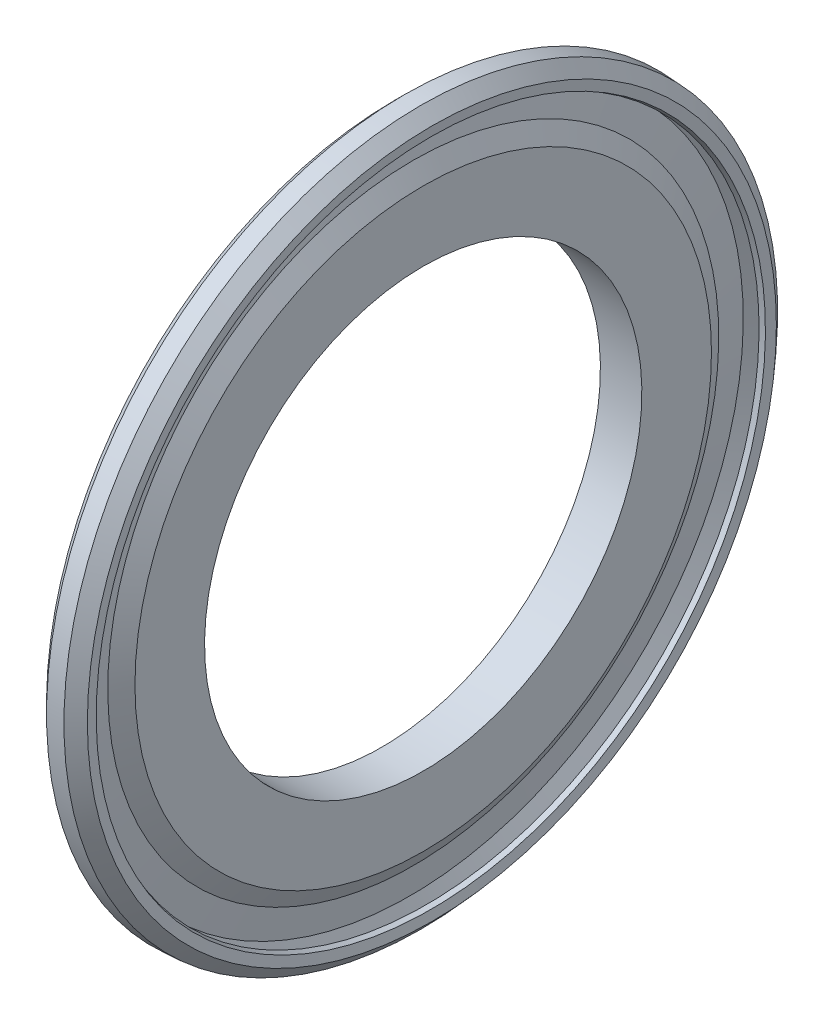
ISO-10303-21;
HEADER;
FILE_DESCRIPTION(('STEP AP214'),'2;1');
FILE_NAME('part.step','',(''),(''),'','','');
FILE_SCHEMA(('AUTOMOTIVE_DESIGN { 1 0 10303 214 1 1 1 1 }'));
ENDSEC;
DATA;
#1=APPLICATION_CONTEXT('core data for automotive mechanical design processes');
#2=APPLICATION_PROTOCOL_DEFINITION('international standard','automotive_design',2000,#1);
#3=PRODUCT_CONTEXT('',#1,'mechanical');
#4=PRODUCT('Part','Part','',(#3));
#5=PRODUCT_RELATED_PRODUCT_CATEGORY('part','',(#4));
#6=PRODUCT_DEFINITION_FORMATION('','',#4);
#7=PRODUCT_DEFINITION_CONTEXT('part definition',#1,'design');
#8=PRODUCT_DEFINITION('design','',#6,#7);
#9=PRODUCT_DEFINITION_SHAPE('','',#8);
#10=(LENGTH_UNIT() NAMED_UNIT(*) SI_UNIT(.MILLI.,.METRE.));
#11=(NAMED_UNIT(*) PLANE_ANGLE_UNIT() SI_UNIT($,.RADIAN.));
#12=(NAMED_UNIT(*) SI_UNIT($,.STERADIAN.) SOLID_ANGLE_UNIT());
#13=UNCERTAINTY_MEASURE_WITH_UNIT(LENGTH_MEASURE(1.E-05),#10,'distance_accuracy_value','');
#14=(GEOMETRIC_REPRESENTATION_CONTEXT(3) GLOBAL_UNCERTAINTY_ASSIGNED_CONTEXT((#13)) GLOBAL_UNIT_ASSIGNED_CONTEXT((#10,
#11,#12)) REPRESENTATION_CONTEXT('',''));
#15=CARTESIAN_POINT('',(0.,0.,0.));
#16=DIRECTION('',(0.,0.,1.));
#17=DIRECTION('',(1.,0.,0.));
#18=AXIS2_PLACEMENT_3D('',#15,#16,#17);
#19=CARTESIAN_POINT('',(1.17595074696361,0.,0.));
#20=DIRECTION('',(-1.,0.,0.));
#21=DIRECTION('',(0.,1.,0.));
#22=AXIS2_PLACEMENT_3D('',#19,#20,#21);
#23=CONICAL_SURFACE('',#22,2.58939401298403,0.837758040957279);
#24=CARTESIAN_POINT('',(1.21689405329676,0.,0.));
#25=DIRECTION('',(-1.,0.,0.));
#26=DIRECTION('',(0.,1.,0.));
#27=AXIS2_PLACEMENT_3D('',#24,#25,#26);
#28=CIRCLE('',#27,2.54392186457195);
#29=CARTESIAN_POINT('',(1.21689405329676,2.54392186457195,0.));
#30=VERTEX_POINT('',#29);
#31=EDGE_CURVE('E11',#30,#30,#28,.T.);
#32=ORIENTED_EDGE('',*,*,#31,.T.);
#33=EDGE_LOOP('',(#32));
#34=FACE_BOUND('',#33,.T.);
#35=CARTESIAN_POINT('',(1.13500744063047,0.,0.));
#36=DIRECTION('',(-1.,0.,0.));
#37=DIRECTION('',(0.,1.,0.));
#38=AXIS2_PLACEMENT_3D('',#35,#36,#37);
#39=CIRCLE('',#38,2.63486616139611);
#40=CARTESIAN_POINT('',(1.13500744063047,2.63486616139611,0.));
#41=VERTEX_POINT('',#40);
#42=EDGE_CURVE('E83',#41,#41,#39,.T.);
#43=ORIENTED_EDGE('',*,*,#42,.F.);
#44=EDGE_LOOP('',(#43));
#45=FACE_BOUND('',#44,.T.);
#46=ADVANCED_FACE('F19',(#34,#45),#23,.T.);
#47=CARTESIAN_POINT('',(1.21561485881621,0.,0.));
#48=DIRECTION('',(1.,0.,0.));
#49=DIRECTION('',(0.,1.,0.));
#50=AXIS2_PLACEMENT_3D('',#47,#48,#49);
#51=CONICAL_SURFACE('',#50,2.53175114207618,1.46607657167523);
#52=ORIENTED_EDGE('',*,*,#31,.F.);
#53=EDGE_LOOP('',(#52));
#54=FACE_BOUND('',#53,.T.);
#55=CARTESIAN_POINT('',(1.20921888641347,0.,0.));
#56=DIRECTION('',(-1.,0.,0.));
#57=DIRECTION('',(0.,1.,0.));
#58=AXIS2_PLACEMENT_3D('',#55,#56,#57);
#59=CIRCLE('',#58,2.47089752959736);
#60=CARTESIAN_POINT('',(1.20921888641347,2.47089752959736,0.));
#61=VERTEX_POINT('',#60);
#62=EDGE_CURVE('E29',#61,#61,#59,.T.);
#63=ORIENTED_EDGE('',*,*,#62,.T.);
#64=EDGE_LOOP('',(#63));
#65=FACE_BOUND('',#64,.T.);
#66=ADVANCED_FACE('F124',(#54,#65),#51,.F.);
#67=CARTESIAN_POINT('',(1.19196928410883,0.,0.));
#68=DIRECTION('',(1.,0.,0.));
#69=DIRECTION('',(0.,1.,0.));
#70=AXIS2_PLACEMENT_3D('',#67,#68,#69);
#71=CONICAL_SURFACE('',#70,2.46461918780554,0.349065850398863);
#72=CARTESIAN_POINT('',(1.1747196818042,0.,0.));
#73=DIRECTION('',(-1.,0.,0.));
#74=DIRECTION('',(0.,1.,0.));
#75=AXIS2_PLACEMENT_3D('',#72,#73,#74);
#76=CIRCLE('',#75,2.45834084601373);
#77=CARTESIAN_POINT('',(1.1747196818042,2.45834084601373,0.));
#78=VERTEX_POINT('',#77);
#79=EDGE_CURVE('E68',#78,#78,#76,.T.);
#80=ORIENTED_EDGE('',*,*,#79,.T.);
#81=EDGE_LOOP('',(#80));
#82=FACE_BOUND('',#81,.T.);
#83=ORIENTED_EDGE('',*,*,#62,.F.);
#84=EDGE_LOOP('',(#83));
#85=FACE_BOUND('',#84,.T.);
#86=ADVANCED_FACE('F69',(#82,#85),#71,.F.);
#87=CARTESIAN_POINT('',(1.1405033328156,0.,0.));
#88=DIRECTION('',(-1.,0.,0.));
#89=DIRECTION('',(0.,1.,0.));
#90=AXIS2_PLACEMENT_3D('',#87,#88,#89);
#91=CONICAL_SURFACE('',#90,2.50906866950923,0.977384381116825);
#92=CARTESIAN_POINT('',(1.10628698382701,0.,0.));
#93=DIRECTION('',(-1.,0.,0.));
#94=DIRECTION('',(0.,1.,0.));
#95=AXIS2_PLACEMENT_3D('',#92,#93,#94);
#96=CIRCLE('',#95,2.55979649300472);
#97=CARTESIAN_POINT('',(1.10628698382701,2.55979649300472,0.));
#98=VERTEX_POINT('',#97);
#99=EDGE_CURVE('E72',#98,#98,#96,.T.);
#100=ORIENTED_EDGE('',*,*,#99,.T.);
#101=EDGE_LOOP('',(#100));
#102=FACE_BOUND('',#101,.T.);
#103=ORIENTED_EDGE('',*,*,#79,.F.);
#104=EDGE_LOOP('',(#103));
#105=FACE_BOUND('',#104,.T.);
#106=ADVANCED_FACE('F119',(#102,#105),#91,.F.);
#107=CARTESIAN_POINT('',(1.08018312218057,0.,0.));
#108=DIRECTION('',(1.,0.,0.));
#109=DIRECTION('',(0.,1.,0.));
#110=AXIS2_PLACEMENT_3D('',#107,#108,#109);
#111=CONICAL_SURFACE('',#110,2.51102511133686,1.07936423665164);
#112=CARTESIAN_POINT('',(1.05407926053413,0.,0.));
#113=DIRECTION('',(-1.,0.,0.));
#114=DIRECTION('',(0.,1.,0.));
#115=AXIS2_PLACEMENT_3D('',#112,#113,#114);
#116=CIRCLE('',#115,2.46225372966898);
#117=CARTESIAN_POINT('',(1.05407926053413,2.46225372966898,0.));
#118=VERTEX_POINT('',#117);
#119=EDGE_CURVE('E75',#118,#118,#116,.T.);
#120=ORIENTED_EDGE('',*,*,#119,.T.);
#121=EDGE_LOOP('',(#120));
#122=FACE_BOUND('',#121,.T.);
#123=ORIENTED_EDGE('',*,*,#99,.F.);
#124=EDGE_LOOP('',(#123));
#125=FACE_BOUND('',#124,.T.);
#126=ADVANCED_FACE('F103',(#122,#125),#111,.F.);
#127=CARTESIAN_POINT('',(1.06675622894778,0.,0.));
#128=DIRECTION('',(-1.,0.,0.));
#129=DIRECTION('',(0.,1.,0.));
#130=AXIS2_PLACEMENT_3D('',#127,#128,#129);
#131=CONICAL_SURFACE('',#130,2.35900810725175,1.44862327915529);
#132=CARTESIAN_POINT('',(1.07943319736143,0.,0.));
#133=DIRECTION('',(-1.,0.,0.));
#134=DIRECTION('',(0.,1.,0.));
#135=AXIS2_PLACEMENT_3D('',#132,#133,#134);
#136=CIRCLE('',#135,2.25576248483451);
#137=CARTESIAN_POINT('',(1.07943319736143,2.25576248483451,0.));
#138=VERTEX_POINT('',#137);
#139=EDGE_CURVE('E84',#138,#138,#136,.T.);
#140=ORIENTED_EDGE('',*,*,#139,.T.);
#141=EDGE_LOOP('',(#140));
#142=FACE_BOUND('',#141,.T.);
#143=ORIENTED_EDGE('',*,*,#119,.F.);
#144=EDGE_LOOP('',(#143));
#145=FACE_BOUND('',#144,.T.);
#146=ADVANCED_FACE('F106',(#142,#145),#131,.T.);
#147=CARTESIAN_POINT('',(1.11614648407471,0.,0.));
#148=DIRECTION('',(-1.,0.,0.));
#149=DIRECTION('',(0.,1.,0.));
#150=AXIS2_PLACEMENT_3D('',#147,#148,#149);
#151=CONICAL_SURFACE('',#150,2.19217320693425,1.0471975511966);
#152=CARTESIAN_POINT('',(1.152859770788,0.,0.));
#153=DIRECTION('',(-1.,0.,0.));
#154=DIRECTION('',(0.,1.,0.));
#155=AXIS2_PLACEMENT_3D('',#152,#153,#154);
#156=CIRCLE('',#155,2.128583929034);
#157=CARTESIAN_POINT('',(1.152859770788,2.128583929034,0.));
#158=VERTEX_POINT('',#157);
#159=EDGE_CURVE('E87',#158,#158,#156,.T.);
#160=ORIENTED_EDGE('',*,*,#159,.T.);
#161=EDGE_LOOP('',(#160));
#162=FACE_BOUND('',#161,.T.);
#163=ORIENTED_EDGE('',*,*,#139,.F.);
#164=EDGE_LOOP('',(#163));
#165=FACE_BOUND('',#164,.T.);
#166=ADVANCED_FACE('F108',(#162,#165),#151,.T.);
#167=CARTESIAN_POINT('',(1.152859770788,1.87159092204099,0.));
#168=DIRECTION('',(1.,0.,0.));
#169=DIRECTION('',(0.,-1.,0.));
#170=AXIS2_PLACEMENT_3D('',#167,#168,#169);
#171=PLANE('',#170);
#172=CARTESIAN_POINT('',(1.152859770788,0.,0.));
#173=DIRECTION('',(-1.,0.,0.));
#174=DIRECTION('',(0.,1.,0.));
#175=AXIS2_PLACEMENT_3D('',#172,#173,#174);
#176=CIRCLE('',#175,1.61459791504798);
#177=CARTESIAN_POINT('',(1.152859770788,1.61459791504798,0.));
#178=VERTEX_POINT('',#177);
#179=EDGE_CURVE('E91',#178,#178,#176,.T.);
#180=ORIENTED_EDGE('',*,*,#179,.T.);
#181=EDGE_LOOP('',(#180));
#182=FACE_BOUND('',#181,.T.);
#183=ORIENTED_EDGE('',*,*,#159,.F.);
#184=EDGE_LOOP('',(#183));
#185=FACE_BOUND('',#184,.T.);
#186=ADVANCED_FACE('F116',(#182,#185),#171,.T.);
#187=CARTESIAN_POINT('',(0.999887742815972,0.,0.));
#188=DIRECTION('',(1.,0.,0.));
#189=DIRECTION('',(0.,1.,0.));
#190=AXIS2_PLACEMENT_3D('',#187,#188,#189);
#191=CYLINDRICAL_SURFACE('',#190,1.61459791504798);
#192=CARTESIAN_POINT('',(0.846915714843944,0.,0.));
#193=DIRECTION('',(-1.,0.,0.));
#194=DIRECTION('',(0.,1.,0.));
#195=AXIS2_PLACEMENT_3D('',#192,#193,#194);
#196=CIRCLE('',#195,1.61459791504798);
#197=CARTESIAN_POINT('',(0.846915714843944,1.61459791504798,0.));
#198=VERTEX_POINT('',#197);
#199=EDGE_CURVE('E93',#198,#198,#196,.T.);
#200=ORIENTED_EDGE('',*,*,#199,.T.);
#201=EDGE_LOOP('',(#200));
#202=FACE_BOUND('',#201,.T.);
#203=ORIENTED_EDGE('',*,*,#179,.F.);
#204=EDGE_LOOP('',(#203));
#205=FACE_BOUND('',#204,.T.);
#206=ADVANCED_FACE('F133',(#202,#205),#191,.F.);
#207=CARTESIAN_POINT('',(0.837352365545255,0.,0.));
#208=DIRECTION('',(-1.,0.,0.));
#209=DIRECTION('',(0.,1.,0.));
#210=AXIS2_PLACEMENT_3D('',#207,#208,#209);
#211=CONICAL_SURFACE('',#210,1.6371277541185,1.1693705988362);
#212=CARTESIAN_POINT('',(0.827789016246567,0.,0.));
#213=DIRECTION('',(-1.,0.,0.));
#214=DIRECTION('',(0.,1.,0.));
#215=AXIS2_PLACEMENT_3D('',#212,#213,#214);
#216=CIRCLE('',#215,1.65965759318901);
#217=CARTESIAN_POINT('',(0.827789016246567,1.65965759318901,0.));
#218=VERTEX_POINT('',#217);
#219=EDGE_CURVE('E94',#218,#218,#216,.T.);
#220=ORIENTED_EDGE('',*,*,#219,.T.);
#221=EDGE_LOOP('',(#220));
#222=FACE_BOUND('',#221,.T.);
#223=ORIENTED_EDGE('',*,*,#199,.F.);
#224=EDGE_LOOP('',(#223));
#225=FACE_BOUND('',#224,.T.);
#226=ADVANCED_FACE('F148',(#222,#225),#211,.F.);
#227=CARTESIAN_POINT('',(0.974642163099713,0.,0.));
#228=DIRECTION('',(1.,0.,0.));
#229=DIRECTION('',(0.,1.,0.));
#230=AXIS2_PLACEMENT_3D('',#227,#228,#229);
#231=CYLINDRICAL_SURFACE('',#230,1.65965759318901);
#232=CARTESIAN_POINT('',(1.12149530995286,0.,0.));
#233=DIRECTION('',(-1.,0.,0.));
#234=DIRECTION('',(0.,1.,0.));
#235=AXIS2_PLACEMENT_3D('',#232,#233,#234);
#236=CIRCLE('',#235,1.65965759318901);
#237=CARTESIAN_POINT('',(1.12149530995286,1.65965759318901,0.));
#238=VERTEX_POINT('',#237);
#239=EDGE_CURVE('E97',#238,#238,#236,.T.);
#240=ORIENTED_EDGE('',*,*,#239,.T.);
#241=EDGE_LOOP('',(#240));
#242=FACE_BOUND('',#241,.T.);
#243=ORIENTED_EDGE('',*,*,#219,.F.);
#244=EDGE_LOOP('',(#243));
#245=FACE_BOUND('',#244,.T.);
#246=ADVANCED_FACE('F145',(#242,#245),#231,.T.);
#247=CARTESIAN_POINT('',(1.12149530995286,1.90441283794426,0.));
#248=DIRECTION('',(-1.,0.,0.));
#249=DIRECTION('',(0.,1.,0.));
#250=AXIS2_PLACEMENT_3D('',#247,#248,#249);
#251=PLANE('',#250);
#252=CARTESIAN_POINT('',(1.12149530995286,0.,0.));
#253=DIRECTION('',(-1.,0.,0.));
#254=DIRECTION('',(0.,1.,0.));
#255=AXIS2_PLACEMENT_3D('',#252,#253,#254);
#256=CIRCLE('',#255,2.1491680826995);
#257=CARTESIAN_POINT('',(1.12149530995286,2.1491680826995,0.));
#258=VERTEX_POINT('',#257);
#259=EDGE_CURVE('E23',#258,#258,#256,.T.);
#260=ORIENTED_EDGE('',*,*,#259,.T.);
#261=EDGE_LOOP('',(#260));
#262=FACE_BOUND('',#261,.T.);
#263=ORIENTED_EDGE('',*,*,#239,.F.);
#264=EDGE_LOOP('',(#263));
#265=FACE_BOUND('',#264,.T.);
#266=ADVANCED_FACE('F140',(#262,#265),#251,.T.);
#267=CARTESIAN_POINT('',(1.03253280258251,0.,0.));
#268=DIRECTION('',(-1.,0.,0.));
#269=DIRECTION('',(0.,1.,0.));
#270=AXIS2_PLACEMENT_3D('',#267,#268,#269);
#271=CONICAL_SURFACE('',#270,2.28106042378781,0.977384381116825);
#272=CARTESIAN_POINT('',(0.943570295212168,0.,0.));
#273=DIRECTION('',(-1.,0.,0.));
#274=DIRECTION('',(0.,1.,0.));
#275=AXIS2_PLACEMENT_3D('',#272,#273,#274);
#276=CIRCLE('',#275,2.4129527648761);
#277=CARTESIAN_POINT('',(0.943570295212168,2.4129527648761,0.));
#278=VERTEX_POINT('',#277);
#279=EDGE_CURVE('E78',#278,#278,#276,.T.);
#280=ORIENTED_EDGE('',*,*,#279,.T.);
#281=EDGE_LOOP('',(#280));
#282=FACE_BOUND('',#281,.T.);
#283=ORIENTED_EDGE('',*,*,#259,.F.);
#284=EDGE_LOOP('',(#283));
#285=FACE_BOUND('',#284,.T.);
#286=ADVANCED_FACE('F136',(#282,#285),#271,.F.);
#287=CARTESIAN_POINT('',(0.943570295212168,2.49249821942156,0.));
#288=DIRECTION('',(-1.,0.,0.));
#289=DIRECTION('',(0.,1.,0.));
#290=AXIS2_PLACEMENT_3D('',#287,#288,#289);
#291=PLANE('',#290);
#292=CARTESIAN_POINT('',(0.943570295212168,0.,0.));
#293=DIRECTION('',(-1.,0.,0.));
#294=DIRECTION('',(0.,1.,0.));
#295=AXIS2_PLACEMENT_3D('',#292,#293,#294);
#296=CIRCLE('',#295,2.57204367396701);
#297=CARTESIAN_POINT('',(0.943570295212168,2.57204367396701,0.));
#298=VERTEX_POINT('',#297);
#299=EDGE_CURVE('E88',#298,#298,#296,.T.);
#300=ORIENTED_EDGE('',*,*,#299,.T.);
#301=EDGE_LOOP('',(#300));
#302=FACE_BOUND('',#301,.T.);
#303=ORIENTED_EDGE('',*,*,#279,.F.);
#304=EDGE_LOOP('',(#303));
#305=FACE_BOUND('',#304,.T.);
#306=ADVANCED_FACE('F139',(#302,#305),#291,.T.);
#307=CARTESIAN_POINT('',(0.978183913871649,0.,0.));
#308=DIRECTION('',(1.,0.,0.));
#309=DIRECTION('',(0.,1.,0.));
#310=AXIS2_PLACEMENT_3D('',#307,#308,#309);
#311=CONICAL_SURFACE('',#310,2.6066572926265,0.785398163397449);
#312=CARTESIAN_POINT('',(1.01279753253113,0.,0.));
#313=DIRECTION('',(-1.,0.,0.));
#314=DIRECTION('',(0.,1.,0.));
#315=AXIS2_PLACEMENT_3D('',#312,#313,#314);
#316=CIRCLE('',#315,2.64127091128598);
#317=CARTESIAN_POINT('',(1.01279753253113,2.64127091128598,0.));
#318=VERTEX_POINT('',#317);
#319=EDGE_CURVE('E80',#318,#318,#316,.T.);
#320=ORIENTED_EDGE('',*,*,#319,.T.);
#321=EDGE_LOOP('',(#320));
#322=FACE_BOUND('',#321,.T.);
#323=ORIENTED_EDGE('',*,*,#299,.F.);
#324=EDGE_LOOP('',(#323));
#325=FACE_BOUND('',#324,.T.);
#326=ADVANCED_FACE('F158',(#322,#325),#311,.T.);
#327=CARTESIAN_POINT('',(1.0739024865808,0.,0.));
#328=DIRECTION('',(-1.,0.,0.));
#329=DIRECTION('',(0.,1.,0.));
#330=AXIS2_PLACEMENT_3D('',#327,#328,#329);
#331=CONICAL_SURFACE('',#330,2.63806853634104,0.0523598775598306);
#332=ORIENTED_EDGE('',*,*,#42,.T.);
#333=EDGE_LOOP('',(#332));
#334=FACE_BOUND('',#333,.T.);
#335=ORIENTED_EDGE('',*,*,#319,.F.);
#336=EDGE_LOOP('',(#335));
#337=FACE_BOUND('',#336,.T.);
#338=ADVANCED_FACE('F21',(#334,#337),#331,.T.);
#339=CLOSED_SHELL('',(#46,#66,#86,#106,#126,#146,#166,#186,#206,#226,#246,#266,#286,#306,#326,#338));
#340=MANIFOLD_SOLID_BREP('B1',#339);
#341=ADVANCED_BREP_SHAPE_REPRESENTATION('',(#18,#340),#14);
#342=SHAPE_DEFINITION_REPRESENTATION(#9,#341);
ENDSEC;
END-ISO-10303-21;
